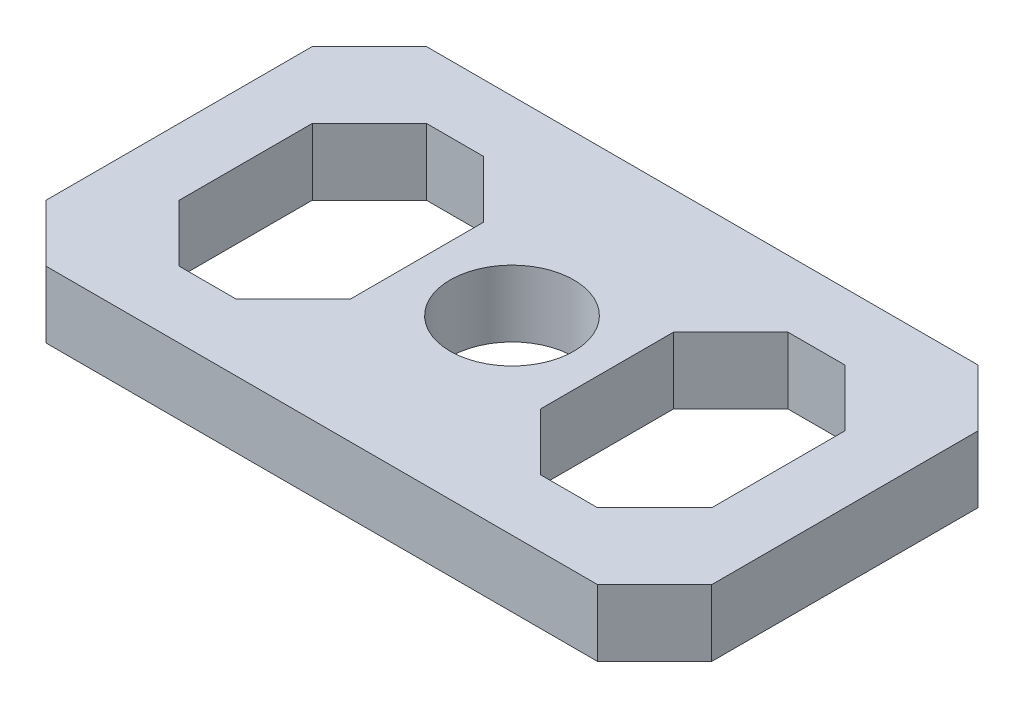
ISO-10303-21;
HEADER;
FILE_DESCRIPTION(('STEP AP214'),'2;1');
FILE_NAME('part.step','',(''),(''),'','','');
FILE_SCHEMA(('AUTOMOTIVE_DESIGN { 1 0 10303 214 1 1 1 1 }'));
ENDSEC;
DATA;
#1=APPLICATION_CONTEXT('core data for automotive mechanical design processes');
#2=APPLICATION_PROTOCOL_DEFINITION('international standard','automotive_design',2000,#1);
#3=PRODUCT_CONTEXT('',#1,'mechanical');
#4=PRODUCT('Part','Part','',(#3));
#5=PRODUCT_RELATED_PRODUCT_CATEGORY('part','',(#4));
#6=PRODUCT_DEFINITION_FORMATION('','',#4);
#7=PRODUCT_DEFINITION_CONTEXT('part definition',#1,'design');
#8=PRODUCT_DEFINITION('design','',#6,#7);
#9=PRODUCT_DEFINITION_SHAPE('','',#8);
#10=(LENGTH_UNIT() NAMED_UNIT(*) SI_UNIT(.MILLI.,.METRE.));
#11=(NAMED_UNIT(*) PLANE_ANGLE_UNIT() SI_UNIT($,.RADIAN.));
#12=(NAMED_UNIT(*) SI_UNIT($,.STERADIAN.) SOLID_ANGLE_UNIT());
#13=UNCERTAINTY_MEASURE_WITH_UNIT(LENGTH_MEASURE(1.E-05),#10,'distance_accuracy_value','');
#14=(GEOMETRIC_REPRESENTATION_CONTEXT(3) GLOBAL_UNCERTAINTY_ASSIGNED_CONTEXT((#13)) GLOBAL_UNIT_ASSIGNED_CONTEXT((#10,
#11,#12)) REPRESENTATION_CONTEXT('',''));
#15=CARTESIAN_POINT('',(0.,0.,0.));
#16=DIRECTION('',(0.,0.,1.));
#17=DIRECTION('',(1.,0.,0.));
#18=AXIS2_PLACEMENT_3D('',#15,#16,#17);
#19=CARTESIAN_POINT('',(0.,7.,0.));
#20=DIRECTION('',(0.,1.,0.));
#21=DIRECTION('',(0.,0.,1.));
#22=AXIS2_PLACEMENT_3D('',#19,#20,#21);
#23=PLANE('',#22);
#24=DIRECTION('',(-1.,0.,0.));
#25=VECTOR('',#24,1.);
#26=CARTESIAN_POINT('',(-35.,7.,-20.));
#27=LINE('',#26,#25);
#28=CARTESIAN_POINT('',(29.,7.,-20.));
#29=VERTEX_POINT('',#28);
#30=CARTESIAN_POINT('',(-29.,7.,-20.));
#31=VERTEX_POINT('',#30);
#32=EDGE_CURVE('E398',#29,#31,#27,.T.);
#33=ORIENTED_EDGE('',*,*,#32,.T.);
#34=DIRECTION('',(0.707106781186549,0.,-0.707106781186546));
#35=VECTOR('',#34,1.);
#36=CARTESIAN_POINT('',(-24.5,7.,-24.5));
#37=LINE('',#36,#35);
#38=CARTESIAN_POINT('',(-35.,7.,-14.));
#39=VERTEX_POINT('',#38);
#40=EDGE_CURVE('E252',#31,#39,#37,.F.);
#41=ORIENTED_EDGE('',*,*,#40,.T.);
#42=DIRECTION('',(0.,0.,1.));
#43=VECTOR('',#42,1.);
#44=CARTESIAN_POINT('',(-35.,7.,-20.));
#45=LINE('',#44,#43);
#46=CARTESIAN_POINT('',(-35.,7.,14.));
#47=VERTEX_POINT('',#46);
#48=EDGE_CURVE('E220',#39,#47,#45,.T.);
#49=ORIENTED_EDGE('',*,*,#48,.T.);
#50=DIRECTION('',(-0.707106781186546,0.,-0.707106781186549));
#51=VECTOR('',#50,1.);
#52=CARTESIAN_POINT('',(-24.5000000000001,7.,24.5));
#53=LINE('',#52,#51);
#54=CARTESIAN_POINT('',(-29.,7.,20.));
#55=VERTEX_POINT('',#54);
#56=EDGE_CURVE('E250',#47,#55,#53,.F.);
#57=ORIENTED_EDGE('',*,*,#56,.T.);
#58=DIRECTION('',(1.,0.,0.));
#59=VECTOR('',#58,1.);
#60=CARTESIAN_POINT('',(-35.,7.,20.));
#61=LINE('',#60,#59);
#62=CARTESIAN_POINT('',(29.,7.,20.));
#63=VERTEX_POINT('',#62);
#64=EDGE_CURVE('E237',#55,#63,#61,.T.);
#65=ORIENTED_EDGE('',*,*,#64,.T.);
#66=DIRECTION('',(-0.707106781186549,0.,0.707106781186546));
#67=VECTOR('',#66,1.);
#68=CARTESIAN_POINT('',(24.4999999999999,7.,24.5));
#69=LINE('',#68,#67);
#70=CARTESIAN_POINT('',(35.,7.,14.));
#71=VERTEX_POINT('',#70);
#72=EDGE_CURVE('E248',#63,#71,#69,.F.);
#73=ORIENTED_EDGE('',*,*,#72,.T.);
#74=DIRECTION('',(0.,0.,-1.));
#75=VECTOR('',#74,1.);
#76=CARTESIAN_POINT('',(35.,7.,-20.));
#77=LINE('',#76,#75);
#78=CARTESIAN_POINT('',(35.,7.,-14.));
#79=VERTEX_POINT('',#78);
#80=EDGE_CURVE('E231',#71,#79,#77,.T.);
#81=ORIENTED_EDGE('',*,*,#80,.T.);
#82=DIRECTION('',(0.707106781186547,0.,0.707106781186548));
#83=VECTOR('',#82,1.);
#84=CARTESIAN_POINT('',(24.5,7.,-24.5));
#85=LINE('',#84,#83);
#86=EDGE_CURVE('E246',#79,#29,#85,.F.);
#87=ORIENTED_EDGE('',*,*,#86,.T.);
#88=EDGE_LOOP('',(#33,#41,#49,#57,#65,#73,#81,#87));
#89=FACE_BOUND('',#88,.T.);
#90=CARTESIAN_POINT('',(0.,7.,0.));
#91=DIRECTION('',(0.,1.,0.));
#92=DIRECTION('',(0.,0.,1.));
#93=AXIS2_PLACEMENT_3D('',#90,#91,#92);
#94=CIRCLE('',#93,6.5);
#95=CARTESIAN_POINT('',(0.,7.,6.5));
#96=VERTEX_POINT('',#95);
#97=EDGE_CURVE('E391',#96,#96,#94,.T.);
#98=ORIENTED_EDGE('',*,*,#97,.F.);
#99=EDGE_LOOP('',(#98));
#100=FACE_BOUND('',#99,.T.);
#101=DIRECTION('',(-1.,0.,0.));
#102=VECTOR('',#101,1.);
#103=CARTESIAN_POINT('',(-28.,7.,-13.));
#104=LINE('',#103,#102);
#105=CARTESIAN_POINT('',(-16.,7.,-13.));
#106=VERTEX_POINT('',#105);
#107=CARTESIAN_POINT('',(-22.,7.,-13.));
#108=VERTEX_POINT('',#107);
#109=EDGE_CURVE('E370',#106,#108,#104,.T.);
#110=ORIENTED_EDGE('',*,*,#109,.F.);
#111=DIRECTION('',(-0.707106781186544,0.,-0.707106781186551));
#112=VECTOR('',#111,1.);
#113=CARTESIAN_POINT('',(-10.,7.,-6.99999999999995));
#114=LINE('',#113,#112);
#115=CARTESIAN_POINT('',(-10.,7.,-6.99999999999995));
#116=VERTEX_POINT('',#115);
#117=EDGE_CURVE('E309',#106,#116,#114,.F.);
#118=ORIENTED_EDGE('',*,*,#117,.T.);
#119=DIRECTION('',(0.,0.,-1.));
#120=VECTOR('',#119,1.);
#121=CARTESIAN_POINT('',(-10.,7.,-13.));
#122=LINE('',#121,#120);
#123=CARTESIAN_POINT('',(-10.,7.,7.00000000000001));
#124=VERTEX_POINT('',#123);
#125=EDGE_CURVE('E367',#124,#116,#122,.T.);
#126=ORIENTED_EDGE('',*,*,#125,.F.);
#127=DIRECTION('',(0.707106781186551,0.,-0.707106781186544));
#128=VECTOR('',#127,1.);
#129=CARTESIAN_POINT('',(-16.,7.,13.));
#130=LINE('',#129,#128);
#131=CARTESIAN_POINT('',(-16.,7.,13.));
#132=VERTEX_POINT('',#131);
#133=EDGE_CURVE('E313',#124,#132,#130,.F.);
#134=ORIENTED_EDGE('',*,*,#133,.T.);
#135=DIRECTION('',(1.,0.,0.));
#136=VECTOR('',#135,1.);
#137=CARTESIAN_POINT('',(-28.,7.,13.));
#138=LINE('',#137,#136);
#139=CARTESIAN_POINT('',(-22.,7.,13.));
#140=VERTEX_POINT('',#139);
#141=EDGE_CURVE('E377',#140,#132,#138,.T.);
#142=ORIENTED_EDGE('',*,*,#141,.F.);
#143=DIRECTION('',(0.707106781186544,0.,0.707106781186551));
#144=VECTOR('',#143,1.);
#145=CARTESIAN_POINT('',(-28.,7.,6.99999999999997));
#146=LINE('',#145,#144);
#147=CARTESIAN_POINT('',(-28.,7.,6.99999999999997));
#148=VERTEX_POINT('',#147);
#149=EDGE_CURVE('E317',#140,#148,#146,.F.);
#150=ORIENTED_EDGE('',*,*,#149,.T.);
#151=DIRECTION('',(0.,0.,1.));
#152=VECTOR('',#151,1.);
#153=CARTESIAN_POINT('',(-28.,7.,-13.));
#154=LINE('',#153,#152);
#155=CARTESIAN_POINT('',(-28.,7.,-7.00000000000002));
#156=VERTEX_POINT('',#155);
#157=EDGE_CURVE('E374',#156,#148,#154,.T.);
#158=ORIENTED_EDGE('',*,*,#157,.F.);
#159=DIRECTION('',(-0.707106781186551,0.,0.707106781186544));
#160=VECTOR('',#159,1.);
#161=CARTESIAN_POINT('',(-22.,7.,-13.));
#162=LINE('',#161,#160);
#163=EDGE_CURVE('E305',#156,#108,#162,.F.);
#164=ORIENTED_EDGE('',*,*,#163,.T.);
#165=EDGE_LOOP('',(#110,#118,#126,#134,#142,#150,#158,#164));
#166=FACE_BOUND('',#165,.T.);
#167=DIRECTION('',(-1.,0.,0.));
#168=VECTOR('',#167,1.);
#169=CARTESIAN_POINT('',(10.,7.,-13.));
#170=LINE('',#169,#168);
#171=CARTESIAN_POINT('',(22.,7.,-13.));
#172=VERTEX_POINT('',#171);
#173=CARTESIAN_POINT('',(16.,7.,-13.));
#174=VERTEX_POINT('',#173);
#175=EDGE_CURVE('E346',#172,#174,#170,.T.);
#176=ORIENTED_EDGE('',*,*,#175,.F.);
#177=DIRECTION('',(-0.707106781186544,0.,-0.707106781186551));
#178=VECTOR('',#177,1.);
#179=CARTESIAN_POINT('',(28.,7.,-6.99999999999996));
#180=LINE('',#179,#178);
#181=CARTESIAN_POINT('',(28.,7.,-6.99999999999996));
#182=VERTEX_POINT('',#181);
#183=EDGE_CURVE('E328',#172,#182,#180,.F.);
#184=ORIENTED_EDGE('',*,*,#183,.T.);
#185=DIRECTION('',(0.,0.,-1.));
#186=VECTOR('',#185,1.);
#187=CARTESIAN_POINT('',(28.,7.,-13.));
#188=LINE('',#187,#186);
#189=CARTESIAN_POINT('',(28.,7.,7.00000000000003));
#190=VERTEX_POINT('',#189);
#191=EDGE_CURVE('E352',#190,#182,#188,.T.);
#192=ORIENTED_EDGE('',*,*,#191,.F.);
#193=DIRECTION('',(0.707106781186551,0.,-0.707106781186544));
#194=VECTOR('',#193,1.);
#195=CARTESIAN_POINT('',(22.,7.,13.));
#196=LINE('',#195,#194);
#197=CARTESIAN_POINT('',(22.,7.,13.));
#198=VERTEX_POINT('',#197);
#199=EDGE_CURVE('E324',#190,#198,#196,.F.);
#200=ORIENTED_EDGE('',*,*,#199,.T.);
#201=DIRECTION('',(1.,0.,0.));
#202=VECTOR('',#201,1.);
#203=CARTESIAN_POINT('',(10.,7.,13.));
#204=LINE('',#203,#202);
#205=CARTESIAN_POINT('',(16.,7.,13.));
#206=VERTEX_POINT('',#205);
#207=EDGE_CURVE('E354',#206,#198,#204,.T.);
#208=ORIENTED_EDGE('',*,*,#207,.F.);
#209=DIRECTION('',(0.707106781186544,0.,0.707106781186551));
#210=VECTOR('',#209,1.);
#211=CARTESIAN_POINT('',(10.,7.,6.99999999999998));
#212=LINE('',#211,#210);
#213=CARTESIAN_POINT('',(10.,7.,6.99999999999998));
#214=VERTEX_POINT('',#213);
#215=EDGE_CURVE('E53',#206,#214,#212,.F.);
#216=ORIENTED_EDGE('',*,*,#215,.T.);
#217=DIRECTION('',(0.,0.,1.));
#218=VECTOR('',#217,1.);
#219=CARTESIAN_POINT('',(10.,7.,-13.));
#220=LINE('',#219,#218);
#221=CARTESIAN_POINT('',(10.,7.,-7.00000000000003));
#222=VERTEX_POINT('',#221);
#223=EDGE_CURVE('E348',#222,#214,#220,.T.);
#224=ORIENTED_EDGE('',*,*,#223,.F.);
#225=DIRECTION('',(-0.707106781186551,0.,0.707106781186544));
#226=VECTOR('',#225,1.);
#227=CARTESIAN_POINT('',(16.,7.,-13.));
#228=LINE('',#227,#226);
#229=EDGE_CURVE('E11',#222,#174,#228,.F.);
#230=ORIENTED_EDGE('',*,*,#229,.T.);
#231=EDGE_LOOP('',(#176,#184,#192,#200,#208,#216,#224,#230));
#232=FACE_BOUND('',#231,.T.);
#233=ADVANCED_FACE('F37',(#89,#100,#166,#232),#23,.T.);
#234=CARTESIAN_POINT('',(0.,0.,0.));
#235=DIRECTION('',(0.,1.,0.));
#236=DIRECTION('',(0.,0.,1.));
#237=AXIS2_PLACEMENT_3D('',#234,#235,#236);
#238=PLANE('',#237);
#239=DIRECTION('',(1.,0.,0.));
#240=VECTOR('',#239,1.);
#241=CARTESIAN_POINT('',(-28.,0.,13.));
#242=LINE('',#241,#240);
#243=CARTESIAN_POINT('',(-22.,0.,13.));
#244=VERTEX_POINT('',#243);
#245=CARTESIAN_POINT('',(-16.,0.,13.));
#246=VERTEX_POINT('',#245);
#247=EDGE_CURVE('E371',#244,#246,#242,.T.);
#248=ORIENTED_EDGE('',*,*,#247,.T.);
#249=DIRECTION('',(-0.707106781186551,0.,0.707106781186544));
#250=VECTOR('',#249,1.);
#251=CARTESIAN_POINT('',(-1.49999999999994,0.,-1.49999999999996));
#252=LINE('',#251,#250);
#253=CARTESIAN_POINT('',(-10.,0.,7.00000000000001));
#254=VERTEX_POINT('',#253);
#255=EDGE_CURVE('E311',#246,#254,#252,.F.);
#256=ORIENTED_EDGE('',*,*,#255,.T.);
#257=DIRECTION('',(0.,0.,-1.));
#258=VECTOR('',#257,1.);
#259=CARTESIAN_POINT('',(-10.,0.,-13.));
#260=LINE('',#259,#258);
#261=CARTESIAN_POINT('',(-10.,0.,-6.99999999999995));
#262=VERTEX_POINT('',#261);
#263=EDGE_CURVE('E361',#254,#262,#260,.T.);
#264=ORIENTED_EDGE('',*,*,#263,.T.);
#265=DIRECTION('',(0.707106781186544,0.,0.707106781186551));
#266=VECTOR('',#265,1.);
#267=CARTESIAN_POINT('',(-1.50000000000007,0.,1.50000000000006));
#268=LINE('',#267,#266);
#269=CARTESIAN_POINT('',(-16.,0.,-13.));
#270=VERTEX_POINT('',#269);
#271=EDGE_CURVE('E307',#262,#270,#268,.F.);
#272=ORIENTED_EDGE('',*,*,#271,.T.);
#273=DIRECTION('',(-1.,0.,0.));
#274=VECTOR('',#273,1.);
#275=CARTESIAN_POINT('',(-28.,0.,-13.));
#276=LINE('',#275,#274);
#277=CARTESIAN_POINT('',(-22.,0.,-13.));
#278=VERTEX_POINT('',#277);
#279=EDGE_CURVE('E383',#270,#278,#276,.T.);
#280=ORIENTED_EDGE('',*,*,#279,.T.);
#281=DIRECTION('',(0.707106781186551,0.,-0.707106781186544));
#282=VECTOR('',#281,1.);
#283=CARTESIAN_POINT('',(-17.4999999999999,0.,-17.5));
#284=LINE('',#283,#282);
#285=CARTESIAN_POINT('',(-28.,0.,-7.00000000000002));
#286=VERTEX_POINT('',#285);
#287=EDGE_CURVE('E303',#278,#286,#284,.F.);
#288=ORIENTED_EDGE('',*,*,#287,.T.);
#289=DIRECTION('',(0.,0.,1.));
#290=VECTOR('',#289,1.);
#291=CARTESIAN_POINT('',(-28.,0.,-13.));
#292=LINE('',#291,#290);
#293=CARTESIAN_POINT('',(-28.,0.,6.99999999999997));
#294=VERTEX_POINT('',#293);
#295=EDGE_CURVE('E386',#286,#294,#292,.T.);
#296=ORIENTED_EDGE('',*,*,#295,.T.);
#297=DIRECTION('',(-0.707106781186544,0.,-0.707106781186551));
#298=VECTOR('',#297,1.);
#299=CARTESIAN_POINT('',(-17.5000000000001,0.,17.5));
#300=LINE('',#299,#298);
#301=EDGE_CURVE('E315',#294,#244,#300,.F.);
#302=ORIENTED_EDGE('',*,*,#301,.T.);
#303=EDGE_LOOP('',(#248,#256,#264,#272,#280,#288,#296,#302));
#304=FACE_BOUND('',#303,.T.);
#305=DIRECTION('',(0.,0.,1.));
#306=VECTOR('',#305,1.);
#307=CARTESIAN_POINT('',(-35.,0.,-20.));
#308=LINE('',#307,#306);
#309=CARTESIAN_POINT('',(-35.,0.,-14.));
#310=VERTEX_POINT('',#309);
#311=CARTESIAN_POINT('',(-35.,0.,14.));
#312=VERTEX_POINT('',#311);
#313=EDGE_CURVE('E217',#310,#312,#308,.T.);
#314=ORIENTED_EDGE('',*,*,#313,.F.);
#315=DIRECTION('',(-0.707106781186549,0.,0.707106781186546));
#316=VECTOR('',#315,1.);
#317=CARTESIAN_POINT('',(-35.,0.,-14.));
#318=LINE('',#317,#316);
#319=CARTESIAN_POINT('',(-29.,0.,-20.));
#320=VERTEX_POINT('',#319);
#321=EDGE_CURVE('E200',#310,#320,#318,.F.);
#322=ORIENTED_EDGE('',*,*,#321,.T.);
#323=DIRECTION('',(-1.,0.,0.));
#324=VECTOR('',#323,1.);
#325=CARTESIAN_POINT('',(-35.,0.,-20.));
#326=LINE('',#325,#324);
#327=CARTESIAN_POINT('',(29.,0.,-20.));
#328=VERTEX_POINT('',#327);
#329=EDGE_CURVE('E228',#328,#320,#326,.T.);
#330=ORIENTED_EDGE('',*,*,#329,.F.);
#331=DIRECTION('',(-0.707106781186547,0.,-0.707106781186548));
#332=VECTOR('',#331,1.);
#333=CARTESIAN_POINT('',(29.,0.,-20.));
#334=LINE('',#333,#332);
#335=CARTESIAN_POINT('',(35.,0.,-14.));
#336=VERTEX_POINT('',#335);
#337=EDGE_CURVE('E221',#328,#336,#334,.F.);
#338=ORIENTED_EDGE('',*,*,#337,.T.);
#339=DIRECTION('',(0.,0.,-1.));
#340=VECTOR('',#339,1.);
#341=CARTESIAN_POINT('',(35.,0.,-20.));
#342=LINE('',#341,#340);
#343=CARTESIAN_POINT('',(35.,0.,14.));
#344=VERTEX_POINT('',#343);
#345=EDGE_CURVE('E233',#344,#336,#342,.T.);
#346=ORIENTED_EDGE('',*,*,#345,.F.);
#347=DIRECTION('',(0.707106781186549,0.,-0.707106781186546));
#348=VECTOR('',#347,1.);
#349=CARTESIAN_POINT('',(35.,0.,14.));
#350=LINE('',#349,#348);
#351=CARTESIAN_POINT('',(29.,0.,20.));
#352=VERTEX_POINT('',#351);
#353=EDGE_CURVE('E240',#344,#352,#350,.F.);
#354=ORIENTED_EDGE('',*,*,#353,.T.);
#355=DIRECTION('',(1.,0.,0.));
#356=VECTOR('',#355,1.);
#357=CARTESIAN_POINT('',(-35.,0.,20.));
#358=LINE('',#357,#356);
#359=CARTESIAN_POINT('',(-29.,0.,20.));
#360=VERTEX_POINT('',#359);
#361=EDGE_CURVE('E227',#360,#352,#358,.T.);
#362=ORIENTED_EDGE('',*,*,#361,.F.);
#363=DIRECTION('',(0.707106781186546,0.,0.707106781186549));
#364=VECTOR('',#363,1.);
#365=CARTESIAN_POINT('',(-29.,0.,20.));
#366=LINE('',#365,#364);
#367=EDGE_CURVE('E211',#360,#312,#366,.F.);
#368=ORIENTED_EDGE('',*,*,#367,.T.);
#369=EDGE_LOOP('',(#314,#322,#330,#338,#346,#354,#362,#368));
#370=FACE_BOUND('',#369,.T.);
#371=CARTESIAN_POINT('',(0.,0.,0.));
#372=DIRECTION('',(0.,1.,0.));
#373=DIRECTION('',(0.,0.,1.));
#374=AXIS2_PLACEMENT_3D('',#371,#372,#373);
#375=CIRCLE('',#374,6.5);
#376=CARTESIAN_POINT('',(0.,0.,6.5));
#377=VERTEX_POINT('',#376);
#378=EDGE_CURVE('E380',#377,#377,#375,.T.);
#379=ORIENTED_EDGE('',*,*,#378,.T.);
#380=EDGE_LOOP('',(#379));
#381=FACE_BOUND('',#380,.T.);
#382=DIRECTION('',(1.,0.,0.));
#383=VECTOR('',#382,1.);
#384=CARTESIAN_POINT('',(10.,0.,13.));
#385=LINE('',#384,#383);
#386=CARTESIAN_POINT('',(16.,0.,13.));
#387=VERTEX_POINT('',#386);
#388=CARTESIAN_POINT('',(22.,0.,13.));
#389=VERTEX_POINT('',#388);
#390=EDGE_CURVE('E340',#387,#389,#385,.T.);
#391=ORIENTED_EDGE('',*,*,#390,.T.);
#392=DIRECTION('',(-0.707106781186551,0.,0.707106781186544));
#393=VECTOR('',#392,1.);
#394=CARTESIAN_POINT('',(17.4999999999999,0.,17.5000000000001));
#395=LINE('',#394,#393);
#396=CARTESIAN_POINT('',(28.,0.,7.00000000000003));
#397=VERTEX_POINT('',#396);
#398=EDGE_CURVE('E322',#389,#397,#395,.F.);
#399=ORIENTED_EDGE('',*,*,#398,.T.);
#400=DIRECTION('',(0.,0.,-1.));
#401=VECTOR('',#400,1.);
#402=CARTESIAN_POINT('',(28.,0.,-13.));
#403=LINE('',#402,#401);
#404=CARTESIAN_POINT('',(28.,0.,-6.99999999999996));
#405=VERTEX_POINT('',#404);
#406=EDGE_CURVE('E362',#397,#405,#403,.T.);
#407=ORIENTED_EDGE('',*,*,#406,.T.);
#408=DIRECTION('',(0.707106781186544,0.,0.707106781186551));
#409=VECTOR('',#408,1.);
#410=CARTESIAN_POINT('',(17.5000000000001,0.,-17.4999999999999));
#411=LINE('',#410,#409);
#412=CARTESIAN_POINT('',(22.,0.,-13.));
#413=VERTEX_POINT('',#412);
#414=EDGE_CURVE('E326',#405,#413,#411,.F.);
#415=ORIENTED_EDGE('',*,*,#414,.T.);
#416=DIRECTION('',(-1.,0.,0.));
#417=VECTOR('',#416,1.);
#418=CARTESIAN_POINT('',(10.,0.,-13.));
#419=LINE('',#418,#417);
#420=CARTESIAN_POINT('',(16.,0.,-13.));
#421=VERTEX_POINT('',#420);
#422=EDGE_CURVE('E335',#413,#421,#419,.T.);
#423=ORIENTED_EDGE('',*,*,#422,.T.);
#424=DIRECTION('',(0.707106781186551,0.,-0.707106781186544));
#425=VECTOR('',#424,1.);
#426=CARTESIAN_POINT('',(1.49999999999994,0.,1.49999999999996));
#427=LINE('',#426,#425);
#428=CARTESIAN_POINT('',(10.,0.,-7.00000000000003));
#429=VERTEX_POINT('',#428);
#430=EDGE_CURVE('E46',#421,#429,#427,.F.);
#431=ORIENTED_EDGE('',*,*,#430,.T.);
#432=DIRECTION('',(0.,0.,1.));
#433=VECTOR('',#432,1.);
#434=CARTESIAN_POINT('',(10.,0.,-13.));
#435=LINE('',#434,#433);
#436=CARTESIAN_POINT('',(10.,0.,6.99999999999998));
#437=VERTEX_POINT('',#436);
#438=EDGE_CURVE('E333',#429,#437,#435,.T.);
#439=ORIENTED_EDGE('',*,*,#438,.T.);
#440=DIRECTION('',(-0.707106781186544,0.,-0.707106781186551));
#441=VECTOR('',#440,1.);
#442=CARTESIAN_POINT('',(1.50000000000007,0.,-1.50000000000005));
#443=LINE('',#442,#441);
#444=EDGE_CURVE('E319',#437,#387,#443,.F.);
#445=ORIENTED_EDGE('',*,*,#444,.T.);
#446=EDGE_LOOP('',(#391,#399,#407,#415,#423,#431,#439,#445));
#447=FACE_BOUND('',#446,.T.);
#448=ADVANCED_FACE('F224',(#304,#370,#381,#447),#238,.F.);
#449=CARTESIAN_POINT('',(35.,7.,-20.));
#450=DIRECTION('',(-1.,0.,0.));
#451=DIRECTION('',(0.,0.,1.));
#452=AXIS2_PLACEMENT_3D('',#449,#450,#451);
#453=PLANE('',#452);
#454=ORIENTED_EDGE('',*,*,#80,.F.);
#455=DIRECTION('',(0.,-1.,0.));
#456=VECTOR('',#455,1.);
#457=CARTESIAN_POINT('',(35.,7.,14.));
#458=LINE('',#457,#456);
#459=EDGE_CURVE('E300',#71,#344,#458,.T.);
#460=ORIENTED_EDGE('',*,*,#459,.T.);
#461=ORIENTED_EDGE('',*,*,#345,.T.);
#462=DIRECTION('',(0.,1.,0.));
#463=VECTOR('',#462,1.);
#464=CARTESIAN_POINT('',(35.,7.,-14.));
#465=LINE('',#464,#463);
#466=EDGE_CURVE('E298',#336,#79,#465,.T.);
#467=ORIENTED_EDGE('',*,*,#466,.T.);
#468=EDGE_LOOP('',(#454,#460,#461,#467));
#469=FACE_BOUND('',#468,.T.);
#470=ADVANCED_FACE('F408',(#469),#453,.F.);
#471=CARTESIAN_POINT('',(-35.,7.,-20.));
#472=DIRECTION('',(0.,0.,1.));
#473=DIRECTION('',(1.,0.,0.));
#474=AXIS2_PLACEMENT_3D('',#471,#472,#473);
#475=PLANE('',#474);
#476=ORIENTED_EDGE('',*,*,#329,.T.);
#477=DIRECTION('',(0.,1.,0.));
#478=VECTOR('',#477,1.);
#479=CARTESIAN_POINT('',(-29.,7.,-20.));
#480=LINE('',#479,#478);
#481=EDGE_CURVE('E205',#320,#31,#480,.T.);
#482=ORIENTED_EDGE('',*,*,#481,.T.);
#483=ORIENTED_EDGE('',*,*,#32,.F.);
#484=DIRECTION('',(0.,-1.,0.));
#485=VECTOR('',#484,1.);
#486=CARTESIAN_POINT('',(29.,7.,-20.));
#487=LINE('',#486,#485);
#488=EDGE_CURVE('E210',#29,#328,#487,.T.);
#489=ORIENTED_EDGE('',*,*,#488,.T.);
#490=EDGE_LOOP('',(#476,#482,#483,#489));
#491=FACE_BOUND('',#490,.T.);
#492=ADVANCED_FACE('F417',(#491),#475,.F.);
#493=CARTESIAN_POINT('',(-35.,7.,-20.));
#494=DIRECTION('',(1.,0.,0.));
#495=DIRECTION('',(0.,0.,-1.));
#496=AXIS2_PLACEMENT_3D('',#493,#494,#495);
#497=PLANE('',#496);
#498=ORIENTED_EDGE('',*,*,#48,.F.);
#499=DIRECTION('',(0.,-1.,0.));
#500=VECTOR('',#499,1.);
#501=CARTESIAN_POINT('',(-35.,7.,-14.));
#502=LINE('',#501,#500);
#503=EDGE_CURVE('E204',#39,#310,#502,.T.);
#504=ORIENTED_EDGE('',*,*,#503,.T.);
#505=ORIENTED_EDGE('',*,*,#313,.T.);
#506=DIRECTION('',(0.,1.,0.));
#507=VECTOR('',#506,1.);
#508=CARTESIAN_POINT('',(-35.,7.,14.));
#509=LINE('',#508,#507);
#510=EDGE_CURVE('E222',#312,#47,#509,.T.);
#511=ORIENTED_EDGE('',*,*,#510,.T.);
#512=EDGE_LOOP('',(#498,#504,#505,#511));
#513=FACE_BOUND('',#512,.T.);
#514=ADVANCED_FACE('F216',(#513),#497,.F.);
#515=CARTESIAN_POINT('',(-35.,7.,20.));
#516=DIRECTION('',(0.,0.,-1.));
#517=DIRECTION('',(-1.,0.,0.));
#518=AXIS2_PLACEMENT_3D('',#515,#516,#517);
#519=PLANE('',#518);
#520=ORIENTED_EDGE('',*,*,#64,.F.);
#521=DIRECTION('',(0.,-1.,0.));
#522=VECTOR('',#521,1.);
#523=CARTESIAN_POINT('',(-29.,7.,20.));
#524=LINE('',#523,#522);
#525=EDGE_CURVE('E256',#55,#360,#524,.T.);
#526=ORIENTED_EDGE('',*,*,#525,.T.);
#527=ORIENTED_EDGE('',*,*,#361,.T.);
#528=DIRECTION('',(0.,1.,0.));
#529=VECTOR('',#528,1.);
#530=CARTESIAN_POINT('',(29.,7.,20.));
#531=LINE('',#530,#529);
#532=EDGE_CURVE('E254',#352,#63,#531,.T.);
#533=ORIENTED_EDGE('',*,*,#532,.T.);
#534=EDGE_LOOP('',(#520,#526,#527,#533));
#535=FACE_BOUND('',#534,.T.);
#536=ADVANCED_FACE('F424',(#535),#519,.F.);
#537=CARTESIAN_POINT('',(0.,7.,0.));
#538=DIRECTION('',(0.,-1.,0.));
#539=DIRECTION('',(0.,0.,-1.));
#540=AXIS2_PLACEMENT_3D('',#537,#538,#539);
#541=CYLINDRICAL_SURFACE('',#540,6.5);
#542=ORIENTED_EDGE('',*,*,#97,.T.);
#543=EDGE_LOOP('',(#542));
#544=FACE_BOUND('',#543,.T.);
#545=ORIENTED_EDGE('',*,*,#378,.F.);
#546=EDGE_LOOP('',(#545));
#547=FACE_BOUND('',#546,.T.);
#548=ADVANCED_FACE('F435',(#544,#547),#541,.F.);
#549=CARTESIAN_POINT('',(-10.,7.,-13.));
#550=DIRECTION('',(-1.,0.,0.));
#551=DIRECTION('',(0.,0.,1.));
#552=AXIS2_PLACEMENT_3D('',#549,#550,#551);
#553=PLANE('',#552);
#554=ORIENTED_EDGE('',*,*,#125,.T.);
#555=DIRECTION('',(0.,-1.,0.));
#556=VECTOR('',#555,1.);
#557=CARTESIAN_POINT('',(-10.,0.,-6.99999999999995));
#558=LINE('',#557,#556);
#559=EDGE_CURVE('E271',#116,#262,#558,.T.);
#560=ORIENTED_EDGE('',*,*,#559,.T.);
#561=ORIENTED_EDGE('',*,*,#263,.F.);
#562=DIRECTION('',(0.,1.,0.));
#563=VECTOR('',#562,1.);
#564=CARTESIAN_POINT('',(-10.,7.,7.00000000000001));
#565=LINE('',#564,#563);
#566=EDGE_CURVE('E269',#254,#124,#565,.T.);
#567=ORIENTED_EDGE('',*,*,#566,.T.);
#568=EDGE_LOOP('',(#554,#560,#561,#567));
#569=FACE_BOUND('',#568,.T.);
#570=ADVANCED_FACE('F443',(#569),#553,.T.);
#571=CARTESIAN_POINT('',(-28.,7.,-13.));
#572=DIRECTION('',(0.,0.,1.));
#573=DIRECTION('',(1.,0.,0.));
#574=AXIS2_PLACEMENT_3D('',#571,#572,#573);
#575=PLANE('',#574);
#576=ORIENTED_EDGE('',*,*,#109,.T.);
#577=DIRECTION('',(0.,-1.,0.));
#578=VECTOR('',#577,1.);
#579=CARTESIAN_POINT('',(-22.,0.,-13.));
#580=LINE('',#579,#578);
#581=EDGE_CURVE('E261',#108,#278,#580,.T.);
#582=ORIENTED_EDGE('',*,*,#581,.T.);
#583=ORIENTED_EDGE('',*,*,#279,.F.);
#584=DIRECTION('',(0.,1.,0.));
#585=VECTOR('',#584,1.);
#586=CARTESIAN_POINT('',(-16.,7.,-13.));
#587=LINE('',#586,#585);
#588=EDGE_CURVE('E259',#270,#106,#587,.T.);
#589=ORIENTED_EDGE('',*,*,#588,.T.);
#590=EDGE_LOOP('',(#576,#582,#583,#589));
#591=FACE_BOUND('',#590,.T.);
#592=ADVANCED_FACE('F645',(#591),#575,.T.);
#593=CARTESIAN_POINT('',(-28.,7.,-13.));
#594=DIRECTION('',(1.,0.,0.));
#595=DIRECTION('',(0.,0.,-1.));
#596=AXIS2_PLACEMENT_3D('',#593,#594,#595);
#597=PLANE('',#596);
#598=ORIENTED_EDGE('',*,*,#295,.F.);
#599=DIRECTION('',(0.,1.,0.));
#600=VECTOR('',#599,1.);
#601=CARTESIAN_POINT('',(-28.,7.,-7.00000000000002));
#602=LINE('',#601,#600);
#603=EDGE_CURVE('E267',#286,#156,#602,.T.);
#604=ORIENTED_EDGE('',*,*,#603,.T.);
#605=ORIENTED_EDGE('',*,*,#157,.T.);
#606=DIRECTION('',(0.,-1.,0.));
#607=VECTOR('',#606,1.);
#608=CARTESIAN_POINT('',(-28.,0.,6.99999999999997));
#609=LINE('',#608,#607);
#610=EDGE_CURVE('E264',#148,#294,#609,.T.);
#611=ORIENTED_EDGE('',*,*,#610,.T.);
#612=EDGE_LOOP('',(#598,#604,#605,#611));
#613=FACE_BOUND('',#612,.T.);
#614=ADVANCED_FACE('F635',(#613),#597,.T.);
#615=CARTESIAN_POINT('',(-28.,7.,13.));
#616=DIRECTION('',(0.,0.,-1.));
#617=DIRECTION('',(-1.,0.,0.));
#618=AXIS2_PLACEMENT_3D('',#615,#616,#617);
#619=PLANE('',#618);
#620=ORIENTED_EDGE('',*,*,#141,.T.);
#621=DIRECTION('',(0.,-1.,0.));
#622=VECTOR('',#621,1.);
#623=CARTESIAN_POINT('',(-16.,0.,13.));
#624=LINE('',#623,#622);
#625=EDGE_CURVE('E276',#132,#246,#624,.T.);
#626=ORIENTED_EDGE('',*,*,#625,.T.);
#627=ORIENTED_EDGE('',*,*,#247,.F.);
#628=DIRECTION('',(0.,1.,0.));
#629=VECTOR('',#628,1.);
#630=CARTESIAN_POINT('',(-22.,7.,13.));
#631=LINE('',#630,#629);
#632=EDGE_CURVE('E274',#244,#140,#631,.T.);
#633=ORIENTED_EDGE('',*,*,#632,.T.);
#634=EDGE_LOOP('',(#620,#626,#627,#633));
#635=FACE_BOUND('',#634,.T.);
#636=ADVANCED_FACE('F625',(#635),#619,.T.);
#637=CARTESIAN_POINT('',(28.,7.,-13.));
#638=DIRECTION('',(-1.,0.,0.));
#639=DIRECTION('',(0.,0.,1.));
#640=AXIS2_PLACEMENT_3D('',#637,#638,#639);
#641=PLANE('',#640);
#642=ORIENTED_EDGE('',*,*,#406,.F.);
#643=DIRECTION('',(0.,1.,0.));
#644=VECTOR('',#643,1.);
#645=CARTESIAN_POINT('',(28.,7.,7.00000000000003));
#646=LINE('',#645,#644);
#647=EDGE_CURVE('E291',#397,#190,#646,.T.);
#648=ORIENTED_EDGE('',*,*,#647,.T.);
#649=ORIENTED_EDGE('',*,*,#191,.T.);
#650=DIRECTION('',(0.,-1.,0.));
#651=VECTOR('',#650,1.);
#652=CARTESIAN_POINT('',(28.,0.,-6.99999999999996));
#653=LINE('',#652,#651);
#654=EDGE_CURVE('E288',#182,#405,#653,.T.);
#655=ORIENTED_EDGE('',*,*,#654,.T.);
#656=EDGE_LOOP('',(#642,#648,#649,#655));
#657=FACE_BOUND('',#656,.T.);
#658=ADVANCED_FACE('F616',(#657),#641,.T.);
#659=CARTESIAN_POINT('',(10.,7.,-13.));
#660=DIRECTION('',(0.,0.,1.));
#661=DIRECTION('',(1.,0.,0.));
#662=AXIS2_PLACEMENT_3D('',#659,#660,#661);
#663=PLANE('',#662);
#664=ORIENTED_EDGE('',*,*,#422,.F.);
#665=DIRECTION('',(0.,1.,0.));
#666=VECTOR('',#665,1.);
#667=CARTESIAN_POINT('',(22.,7.,-13.));
#668=LINE('',#667,#666);
#669=EDGE_CURVE('E296',#413,#172,#668,.T.);
#670=ORIENTED_EDGE('',*,*,#669,.T.);
#671=ORIENTED_EDGE('',*,*,#175,.T.);
#672=DIRECTION('',(0.,-1.,0.));
#673=VECTOR('',#672,1.);
#674=CARTESIAN_POINT('',(16.,0.,-13.));
#675=LINE('',#674,#673);
#676=EDGE_CURVE('E293',#174,#421,#675,.T.);
#677=ORIENTED_EDGE('',*,*,#676,.T.);
#678=EDGE_LOOP('',(#664,#670,#671,#677));
#679=FACE_BOUND('',#678,.T.);
#680=ADVANCED_FACE('F350',(#679),#663,.T.);
#681=CARTESIAN_POINT('',(10.,7.,-13.));
#682=DIRECTION('',(1.,0.,0.));
#683=DIRECTION('',(0.,0.,-1.));
#684=AXIS2_PLACEMENT_3D('',#681,#682,#683);
#685=PLANE('',#684);
#686=ORIENTED_EDGE('',*,*,#223,.T.);
#687=DIRECTION('',(0.,-1.,0.));
#688=VECTOR('',#687,1.);
#689=CARTESIAN_POINT('',(10.,0.,6.99999999999998));
#690=LINE('',#689,#688);
#691=EDGE_CURVE('E280',#214,#437,#690,.T.);
#692=ORIENTED_EDGE('',*,*,#691,.T.);
#693=ORIENTED_EDGE('',*,*,#438,.F.);
#694=DIRECTION('',(0.,1.,0.));
#695=VECTOR('',#694,1.);
#696=CARTESIAN_POINT('',(10.,7.,-7.00000000000003));
#697=LINE('',#696,#695);
#698=EDGE_CURVE('E60',#429,#222,#697,.T.);
#699=ORIENTED_EDGE('',*,*,#698,.T.);
#700=EDGE_LOOP('',(#686,#692,#693,#699));
#701=FACE_BOUND('',#700,.T.);
#702=ADVANCED_FACE('F338',(#701),#685,.T.);
#703=CARTESIAN_POINT('',(10.,7.,13.));
#704=DIRECTION('',(0.,0.,-1.));
#705=DIRECTION('',(-1.,0.,0.));
#706=AXIS2_PLACEMENT_3D('',#703,#704,#705);
#707=PLANE('',#706);
#708=ORIENTED_EDGE('',*,*,#390,.F.);
#709=DIRECTION('',(0.,1.,0.));
#710=VECTOR('',#709,1.);
#711=CARTESIAN_POINT('',(16.,7.,13.));
#712=LINE('',#711,#710);
#713=EDGE_CURVE('E286',#387,#206,#712,.T.);
#714=ORIENTED_EDGE('',*,*,#713,.T.);
#715=ORIENTED_EDGE('',*,*,#207,.T.);
#716=DIRECTION('',(0.,-1.,0.));
#717=VECTOR('',#716,1.);
#718=CARTESIAN_POINT('',(22.,0.,13.));
#719=LINE('',#718,#717);
#720=EDGE_CURVE('E283',#198,#389,#719,.T.);
#721=ORIENTED_EDGE('',*,*,#720,.T.);
#722=EDGE_LOOP('',(#708,#714,#715,#721));
#723=FACE_BOUND('',#722,.T.);
#724=ADVANCED_FACE('F462',(#723),#707,.T.);
#725=CARTESIAN_POINT('',(-35.,7.,-14.));
#726=DIRECTION('',(0.707106781186546,0.,0.707106781186549));
#727=DIRECTION('',(0.,-1.,0.));
#728=AXIS2_PLACEMENT_3D('',#725,#726,#727);
#729=PLANE('',#728);
#730=ORIENTED_EDGE('',*,*,#40,.F.);
#731=ORIENTED_EDGE('',*,*,#481,.F.);
#732=ORIENTED_EDGE('',*,*,#321,.F.);
#733=ORIENTED_EDGE('',*,*,#503,.F.);
#734=EDGE_LOOP('',(#730,#731,#732,#733));
#735=FACE_BOUND('',#734,.T.);
#736=ADVANCED_FACE('F203',(#735),#729,.F.);
#737=CARTESIAN_POINT('',(-29.,7.,20.));
#738=DIRECTION('',(0.707106781186549,0.,-0.707106781186546));
#739=DIRECTION('',(0.,-1.,0.));
#740=AXIS2_PLACEMENT_3D('',#737,#738,#739);
#741=PLANE('',#740);
#742=ORIENTED_EDGE('',*,*,#56,.F.);
#743=ORIENTED_EDGE('',*,*,#510,.F.);
#744=ORIENTED_EDGE('',*,*,#367,.F.);
#745=ORIENTED_EDGE('',*,*,#525,.F.);
#746=EDGE_LOOP('',(#742,#743,#744,#745));
#747=FACE_BOUND('',#746,.T.);
#748=ADVANCED_FACE('F451',(#747),#741,.F.);
#749=CARTESIAN_POINT('',(-22.,7.,-13.));
#750=DIRECTION('',(0.707106781186544,0.,0.707106781186551));
#751=DIRECTION('',(0.,1.,0.));
#752=AXIS2_PLACEMENT_3D('',#749,#750,#751);
#753=PLANE('',#752);
#754=ORIENTED_EDGE('',*,*,#163,.F.);
#755=ORIENTED_EDGE('',*,*,#603,.F.);
#756=ORIENTED_EDGE('',*,*,#287,.F.);
#757=ORIENTED_EDGE('',*,*,#581,.F.);
#758=EDGE_LOOP('',(#754,#755,#756,#757));
#759=FACE_BOUND('',#758,.T.);
#760=ADVANCED_FACE('F453',(#759),#753,.T.);
#761=CARTESIAN_POINT('',(-10.,7.,-6.99999999999995));
#762=DIRECTION('',(-0.707106781186551,0.,0.707106781186544));
#763=DIRECTION('',(0.,1.,0.));
#764=AXIS2_PLACEMENT_3D('',#761,#762,#763);
#765=PLANE('',#764);
#766=ORIENTED_EDGE('',*,*,#117,.F.);
#767=ORIENTED_EDGE('',*,*,#588,.F.);
#768=ORIENTED_EDGE('',*,*,#271,.F.);
#769=ORIENTED_EDGE('',*,*,#559,.F.);
#770=EDGE_LOOP('',(#766,#767,#768,#769));
#771=FACE_BOUND('',#770,.T.);
#772=ADVANCED_FACE('F459',(#771),#765,.T.);
#773=CARTESIAN_POINT('',(-16.,7.,13.));
#774=DIRECTION('',(-0.707106781186544,0.,-0.707106781186551));
#775=DIRECTION('',(0.,1.,0.));
#776=AXIS2_PLACEMENT_3D('',#773,#774,#775);
#777=PLANE('',#776);
#778=ORIENTED_EDGE('',*,*,#133,.F.);
#779=ORIENTED_EDGE('',*,*,#566,.F.);
#780=ORIENTED_EDGE('',*,*,#255,.F.);
#781=ORIENTED_EDGE('',*,*,#625,.F.);
#782=EDGE_LOOP('',(#778,#779,#780,#781));
#783=FACE_BOUND('',#782,.T.);
#784=ADVANCED_FACE('F478',(#783),#777,.T.);
#785=CARTESIAN_POINT('',(-28.,7.,6.99999999999997));
#786=DIRECTION('',(0.707106781186551,0.,-0.707106781186544));
#787=DIRECTION('',(0.,1.,0.));
#788=AXIS2_PLACEMENT_3D('',#785,#786,#787);
#789=PLANE('',#788);
#790=ORIENTED_EDGE('',*,*,#149,.F.);
#791=ORIENTED_EDGE('',*,*,#632,.F.);
#792=ORIENTED_EDGE('',*,*,#301,.F.);
#793=ORIENTED_EDGE('',*,*,#610,.F.);
#794=EDGE_LOOP('',(#790,#791,#792,#793));
#795=FACE_BOUND('',#794,.T.);
#796=ADVANCED_FACE('F485',(#795),#789,.T.);
#797=CARTESIAN_POINT('',(10.,7.,6.99999999999998));
#798=DIRECTION('',(0.707106781186551,0.,-0.707106781186544));
#799=DIRECTION('',(0.,1.,0.));
#800=AXIS2_PLACEMENT_3D('',#797,#798,#799);
#801=PLANE('',#800);
#802=ORIENTED_EDGE('',*,*,#215,.F.);
#803=ORIENTED_EDGE('',*,*,#713,.F.);
#804=ORIENTED_EDGE('',*,*,#444,.F.);
#805=ORIENTED_EDGE('',*,*,#691,.F.);
#806=EDGE_LOOP('',(#802,#803,#804,#805));
#807=FACE_BOUND('',#806,.T.);
#808=ADVANCED_FACE('F492',(#807),#801,.T.);
#809=CARTESIAN_POINT('',(22.,7.,13.));
#810=DIRECTION('',(-0.707106781186544,0.,-0.707106781186551));
#811=DIRECTION('',(0.,1.,0.));
#812=AXIS2_PLACEMENT_3D('',#809,#810,#811);
#813=PLANE('',#812);
#814=ORIENTED_EDGE('',*,*,#199,.F.);
#815=ORIENTED_EDGE('',*,*,#647,.F.);
#816=ORIENTED_EDGE('',*,*,#398,.F.);
#817=ORIENTED_EDGE('',*,*,#720,.F.);
#818=EDGE_LOOP('',(#814,#815,#816,#817));
#819=FACE_BOUND('',#818,.T.);
#820=ADVANCED_FACE('F499',(#819),#813,.T.);
#821=CARTESIAN_POINT('',(28.,7.,-6.99999999999996));
#822=DIRECTION('',(-0.707106781186551,0.,0.707106781186544));
#823=DIRECTION('',(0.,1.,0.));
#824=AXIS2_PLACEMENT_3D('',#821,#822,#823);
#825=PLANE('',#824);
#826=ORIENTED_EDGE('',*,*,#183,.F.);
#827=ORIENTED_EDGE('',*,*,#669,.F.);
#828=ORIENTED_EDGE('',*,*,#414,.F.);
#829=ORIENTED_EDGE('',*,*,#654,.F.);
#830=EDGE_LOOP('',(#826,#827,#828,#829));
#831=FACE_BOUND('',#830,.T.);
#832=ADVANCED_FACE('F506',(#831),#825,.T.);
#833=CARTESIAN_POINT('',(16.,7.,-13.));
#834=DIRECTION('',(0.707106781186544,0.,0.707106781186551));
#835=DIRECTION('',(0.,1.,0.));
#836=AXIS2_PLACEMENT_3D('',#833,#834,#835);
#837=PLANE('',#836);
#838=ORIENTED_EDGE('',*,*,#229,.F.);
#839=ORIENTED_EDGE('',*,*,#698,.F.);
#840=ORIENTED_EDGE('',*,*,#430,.F.);
#841=ORIENTED_EDGE('',*,*,#676,.F.);
#842=EDGE_LOOP('',(#838,#839,#840,#841));
#843=FACE_BOUND('',#842,.T.);
#844=ADVANCED_FACE('F343',(#843),#837,.T.);
#845=CARTESIAN_POINT('',(35.,7.,14.));
#846=DIRECTION('',(-0.707106781186546,0.,-0.707106781186549));
#847=DIRECTION('',(0.,-1.,0.));
#848=AXIS2_PLACEMENT_3D('',#845,#846,#847);
#849=PLANE('',#848);
#850=ORIENTED_EDGE('',*,*,#72,.F.);
#851=ORIENTED_EDGE('',*,*,#532,.F.);
#852=ORIENTED_EDGE('',*,*,#353,.F.);
#853=ORIENTED_EDGE('',*,*,#459,.F.);
#854=EDGE_LOOP('',(#850,#851,#852,#853));
#855=FACE_BOUND('',#854,.T.);
#856=ADVANCED_FACE('F518',(#855),#849,.F.);
#857=CARTESIAN_POINT('',(29.,7.,-20.));
#858=DIRECTION('',(-0.707106781186548,0.,0.707106781186547));
#859=DIRECTION('',(0.,-1.,0.));
#860=AXIS2_PLACEMENT_3D('',#857,#858,#859);
#861=PLANE('',#860);
#862=ORIENTED_EDGE('',*,*,#86,.F.);
#863=ORIENTED_EDGE('',*,*,#466,.F.);
#864=ORIENTED_EDGE('',*,*,#337,.F.);
#865=ORIENTED_EDGE('',*,*,#488,.F.);
#866=EDGE_LOOP('',(#862,#863,#864,#865));
#867=FACE_BOUND('',#866,.T.);
#868=ADVANCED_FACE('F40',(#867),#861,.F.);
#869=CLOSED_SHELL('',(#233,#448,#470,#492,#514,#536,#548,#570,#592,#614,#636,#658,#680,#702,
#724,#736,#748,#760,#772,#784,#796,#808,#820,#832,#844,#856,#868));
#870=MANIFOLD_SOLID_BREP('B2',#869);
#871=ADVANCED_BREP_SHAPE_REPRESENTATION('',(#18,#870),#14);
#872=SHAPE_DEFINITION_REPRESENTATION(#9,#871);
ENDSEC;
END-ISO-10303-21;
